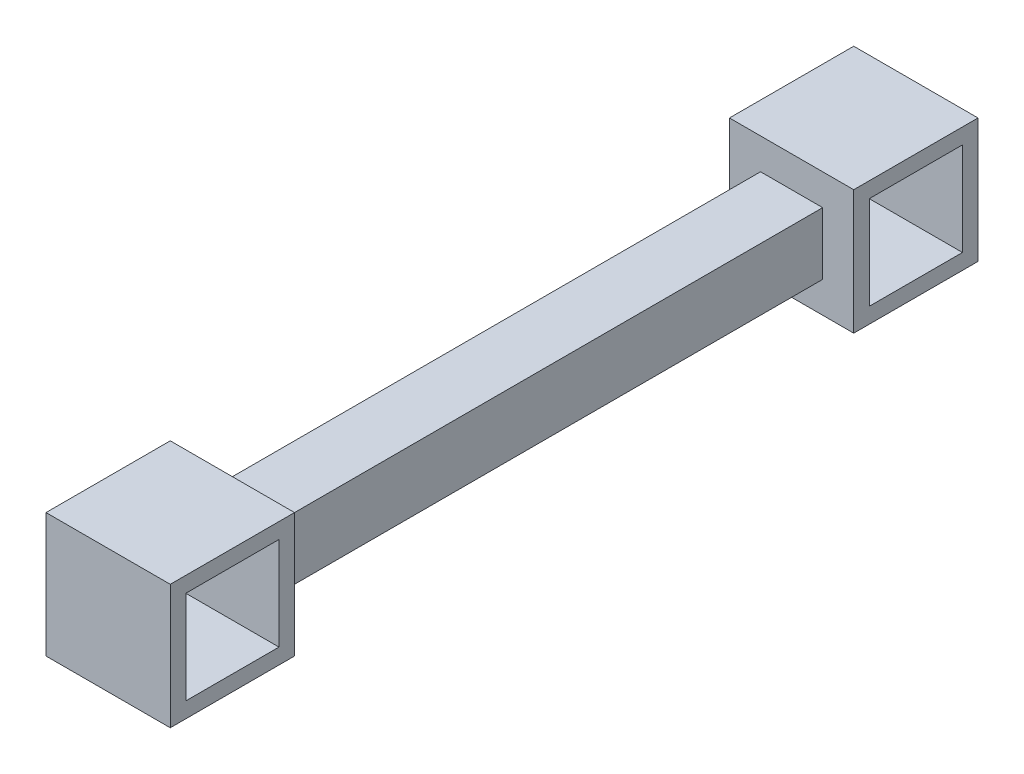
ISO-10303-21;
HEADER;
FILE_DESCRIPTION(('STEP AP214'),'2;1');
FILE_NAME('part.step','',(''),(''),'','','');
FILE_SCHEMA(('AUTOMOTIVE_DESIGN { 1 0 10303 214 1 1 1 1 }'));
ENDSEC;
DATA;
#1=APPLICATION_CONTEXT('core data for automotive mechanical design processes');
#2=APPLICATION_PROTOCOL_DEFINITION('international standard','automotive_design',2000,#1);
#3=PRODUCT_CONTEXT('',#1,'mechanical');
#4=PRODUCT('Part','Part','',(#3));
#5=PRODUCT_RELATED_PRODUCT_CATEGORY('part','',(#4));
#6=PRODUCT_DEFINITION_FORMATION('','',#4);
#7=PRODUCT_DEFINITION_CONTEXT('part definition',#1,'design');
#8=PRODUCT_DEFINITION('design','',#6,#7);
#9=PRODUCT_DEFINITION_SHAPE('','',#8);
#10=(LENGTH_UNIT() NAMED_UNIT(*) SI_UNIT(.MILLI.,.METRE.));
#11=(NAMED_UNIT(*) PLANE_ANGLE_UNIT() SI_UNIT($,.RADIAN.));
#12=(NAMED_UNIT(*) SI_UNIT($,.STERADIAN.) SOLID_ANGLE_UNIT());
#13=UNCERTAINTY_MEASURE_WITH_UNIT(LENGTH_MEASURE(1.E-05),#10,'distance_accuracy_value','');
#14=(GEOMETRIC_REPRESENTATION_CONTEXT(3) GLOBAL_UNCERTAINTY_ASSIGNED_CONTEXT((#13)) GLOBAL_UNIT_ASSIGNED_CONTEXT((#10,
#11,#12)) REPRESENTATION_CONTEXT('',''));
#15=CARTESIAN_POINT('',(0.,0.,0.));
#16=DIRECTION('',(0.,0.,1.));
#17=DIRECTION('',(1.,0.,0.));
#18=AXIS2_PLACEMENT_3D('',#15,#16,#17);
#19=CARTESIAN_POINT('',(-20.,20.,260.));
#20=DIRECTION('',(1.,0.,0.));
#21=DIRECTION('',(0.,1.,0.));
#22=AXIS2_PLACEMENT_3D('',#19,#20,#21);
#23=PLANE('',#22);
#24=DIRECTION('',(0.,0.,1.));
#25=VECTOR('',#24,1.);
#26=CARTESIAN_POINT('',(-20.,-15.,35.));
#27=LINE('',#26,#25);
#28=CARTESIAN_POINT('',(-20.,-15.,5.));
#29=VERTEX_POINT('',#28);
#30=CARTESIAN_POINT('',(-20.,-15.,35.));
#31=VERTEX_POINT('',#30);
#32=EDGE_CURVE('E219',#29,#31,#27,.T.);
#33=ORIENTED_EDGE('',*,*,#32,.F.);
#34=DIRECTION('',(0.,-1.,0.));
#35=VECTOR('',#34,1.);
#36=CARTESIAN_POINT('',(-20.,-15.,5.00000000000001));
#37=LINE('',#36,#35);
#38=CARTESIAN_POINT('',(-20.,15.,5.00000000000001));
#39=VERTEX_POINT('',#38);
#40=EDGE_CURVE('E63',#39,#29,#37,.T.);
#41=ORIENTED_EDGE('',*,*,#40,.F.);
#42=DIRECTION('',(0.,0.,-1.));
#43=VECTOR('',#42,1.);
#44=CARTESIAN_POINT('',(-20.,15.,35.));
#45=LINE('',#44,#43);
#46=CARTESIAN_POINT('',(-20.,15.,35.));
#47=VERTEX_POINT('',#46);
#48=EDGE_CURVE('E206',#47,#39,#45,.T.);
#49=ORIENTED_EDGE('',*,*,#48,.F.);
#50=DIRECTION('',(0.,1.,0.));
#51=VECTOR('',#50,1.);
#52=CARTESIAN_POINT('',(-20.,-15.,35.));
#53=LINE('',#52,#51);
#54=EDGE_CURVE('E210',#31,#47,#53,.T.);
#55=ORIENTED_EDGE('',*,*,#54,.F.);
#56=EDGE_LOOP('',(#33,#41,#49,#55));
#57=FACE_BOUND('',#56,.T.);
#58=DIRECTION('',(0.,-1.,0.));
#59=VECTOR('',#58,1.);
#60=CARTESIAN_POINT('',(-20.,20.,40.));
#61=LINE('',#60,#59);
#62=CARTESIAN_POINT('',(-20.,20.,40.));
#63=VERTEX_POINT('',#62);
#64=CARTESIAN_POINT('',(-20.,-20.,40.));
#65=VERTEX_POINT('',#64);
#66=EDGE_CURVE('E322',#63,#65,#61,.T.);
#67=ORIENTED_EDGE('',*,*,#66,.F.);
#68=DIRECTION('',(0.,0.,-1.));
#69=VECTOR('',#68,1.);
#70=CARTESIAN_POINT('',(-20.,20.,260.));
#71=LINE('',#70,#69);
#72=CARTESIAN_POINT('',(-20.,20.,0.));
#73=VERTEX_POINT('',#72);
#74=EDGE_CURVE('E364',#63,#73,#71,.T.);
#75=ORIENTED_EDGE('',*,*,#74,.T.);
#76=DIRECTION('',(0.,-1.,0.));
#77=VECTOR('',#76,1.);
#78=CARTESIAN_POINT('',(-20.,20.,0.));
#79=LINE('',#78,#77);
#80=CARTESIAN_POINT('',(-20.,-20.,0.));
#81=VERTEX_POINT('',#80);
#82=EDGE_CURVE('E335',#73,#81,#79,.T.);
#83=ORIENTED_EDGE('',*,*,#82,.T.);
#84=DIRECTION('',(0.,0.,-1.));
#85=VECTOR('',#84,1.);
#86=CARTESIAN_POINT('',(-20.,-20.,260.));
#87=LINE('',#86,#85);
#88=EDGE_CURVE('E56',#65,#81,#87,.T.);
#89=ORIENTED_EDGE('',*,*,#88,.F.);
#90=EDGE_LOOP('',(#67,#75,#83,#89));
#91=FACE_BOUND('',#90,.T.);
#92=ADVANCED_FACE('F47',(#57,#91),#23,.F.);
#93=CARTESIAN_POINT('',(20.,-20.,260.));
#94=DIRECTION('',(0.,1.,0.));
#95=DIRECTION('',(-1.,0.,0.));
#96=AXIS2_PLACEMENT_3D('',#93,#94,#95);
#97=PLANE('',#96);
#98=DIRECTION('',(1.,0.,0.));
#99=VECTOR('',#98,1.);
#100=CARTESIAN_POINT('',(-20.,-20.,40.));
#101=LINE('',#100,#99);
#102=CARTESIAN_POINT('',(20.,-20.,40.));
#103=VERTEX_POINT('',#102);
#104=EDGE_CURVE('E325',#65,#103,#101,.T.);
#105=ORIENTED_EDGE('',*,*,#104,.F.);
#106=ORIENTED_EDGE('',*,*,#88,.T.);
#107=DIRECTION('',(1.,0.,0.));
#108=VECTOR('',#107,1.);
#109=CARTESIAN_POINT('',(20.,-20.,0.));
#110=LINE('',#109,#108);
#111=CARTESIAN_POINT('',(20.,-20.,0.));
#112=VERTEX_POINT('',#111);
#113=EDGE_CURVE('E368',#81,#112,#110,.T.);
#114=ORIENTED_EDGE('',*,*,#113,.T.);
#115=DIRECTION('',(0.,0.,-1.));
#116=VECTOR('',#115,1.);
#117=CARTESIAN_POINT('',(20.,-20.,260.));
#118=LINE('',#117,#116);
#119=EDGE_CURVE('E387',#103,#112,#118,.T.);
#120=ORIENTED_EDGE('',*,*,#119,.F.);
#121=EDGE_LOOP('',(#105,#106,#114,#120));
#122=FACE_BOUND('',#121,.T.);
#123=ADVANCED_FACE('F404',(#122),#97,.F.);
#124=CARTESIAN_POINT('',(20.,20.,260.));
#125=DIRECTION('',(-1.,0.,0.));
#126=DIRECTION('',(0.,-1.,0.));
#127=AXIS2_PLACEMENT_3D('',#124,#125,#126);
#128=PLANE('',#127);
#129=DIRECTION('',(0.,0.,-1.));
#130=VECTOR('',#129,1.);
#131=CARTESIAN_POINT('',(20.,15.,35.));
#132=LINE('',#131,#130);
#133=CARTESIAN_POINT('',(20.,15.,35.));
#134=VERTEX_POINT('',#133);
#135=CARTESIAN_POINT('',(20.,15.,5.00000000000001));
#136=VERTEX_POINT('',#135);
#137=EDGE_CURVE('E194',#134,#136,#132,.T.);
#138=ORIENTED_EDGE('',*,*,#137,.T.);
#139=DIRECTION('',(0.,-1.,0.));
#140=VECTOR('',#139,1.);
#141=CARTESIAN_POINT('',(20.,-15.,5.00000000000001));
#142=LINE('',#141,#140);
#143=CARTESIAN_POINT('',(20.,-15.,5.00000000000001));
#144=VERTEX_POINT('',#143);
#145=EDGE_CURVE('E187',#136,#144,#142,.T.);
#146=ORIENTED_EDGE('',*,*,#145,.T.);
#147=DIRECTION('',(0.,0.,1.));
#148=VECTOR('',#147,1.);
#149=CARTESIAN_POINT('',(20.,-15.,35.));
#150=LINE('',#149,#148);
#151=CARTESIAN_POINT('',(20.,-15.,35.));
#152=VERTEX_POINT('',#151);
#153=EDGE_CURVE('E197',#144,#152,#150,.T.);
#154=ORIENTED_EDGE('',*,*,#153,.T.);
#155=DIRECTION('',(0.,1.,0.));
#156=VECTOR('',#155,1.);
#157=CARTESIAN_POINT('',(20.,-15.,35.));
#158=LINE('',#157,#156);
#159=EDGE_CURVE('E71',#152,#134,#158,.T.);
#160=ORIENTED_EDGE('',*,*,#159,.T.);
#161=EDGE_LOOP('',(#138,#146,#154,#160));
#162=FACE_BOUND('',#161,.T.);
#163=DIRECTION('',(0.,1.,0.));
#164=VECTOR('',#163,1.);
#165=CARTESIAN_POINT('',(20.,-20.,40.));
#166=LINE('',#165,#164);
#167=CARTESIAN_POINT('',(20.,20.,40.));
#168=VERTEX_POINT('',#167);
#169=EDGE_CURVE('E329',#103,#168,#166,.T.);
#170=ORIENTED_EDGE('',*,*,#169,.F.);
#171=ORIENTED_EDGE('',*,*,#119,.T.);
#172=DIRECTION('',(0.,1.,0.));
#173=VECTOR('',#172,1.);
#174=CARTESIAN_POINT('',(20.,20.,0.));
#175=LINE('',#174,#173);
#176=CARTESIAN_POINT('',(20.,20.,0.));
#177=VERTEX_POINT('',#176);
#178=EDGE_CURVE('E372',#112,#177,#175,.T.);
#179=ORIENTED_EDGE('',*,*,#178,.T.);
#180=DIRECTION('',(0.,0.,-1.));
#181=VECTOR('',#180,1.);
#182=CARTESIAN_POINT('',(20.,20.,260.));
#183=LINE('',#182,#181);
#184=EDGE_CURVE('E383',#168,#177,#183,.T.);
#185=ORIENTED_EDGE('',*,*,#184,.F.);
#186=EDGE_LOOP('',(#170,#171,#179,#185));
#187=FACE_BOUND('',#186,.T.);
#188=ADVANCED_FACE('F202',(#162,#187),#128,.F.);
#189=CARTESIAN_POINT('',(20.,20.,260.));
#190=DIRECTION('',(0.,-1.,0.));
#191=DIRECTION('',(1.,0.,0.));
#192=AXIS2_PLACEMENT_3D('',#189,#190,#191);
#193=PLANE('',#192);
#194=DIRECTION('',(-1.,0.,0.));
#195=VECTOR('',#194,1.);
#196=CARTESIAN_POINT('',(20.,20.,40.));
#197=LINE('',#196,#195);
#198=EDGE_CURVE('E332',#168,#63,#197,.T.);
#199=ORIENTED_EDGE('',*,*,#198,.F.);
#200=ORIENTED_EDGE('',*,*,#184,.T.);
#201=DIRECTION('',(-1.,0.,0.));
#202=VECTOR('',#201,1.);
#203=CARTESIAN_POINT('',(20.,20.,0.));
#204=LINE('',#203,#202);
#205=EDGE_CURVE('E355',#177,#73,#204,.T.);
#206=ORIENTED_EDGE('',*,*,#205,.T.);
#207=ORIENTED_EDGE('',*,*,#74,.F.);
#208=EDGE_LOOP('',(#199,#200,#206,#207));
#209=FACE_BOUND('',#208,.T.);
#210=ADVANCED_FACE('F412',(#209),#193,.F.);
#211=CARTESIAN_POINT('',(0.,0.,0.));
#212=DIRECTION('',(0.,0.,-1.));
#213=DIRECTION('',(-1.,0.,0.));
#214=AXIS2_PLACEMENT_3D('',#211,#212,#213);
#215=PLANE('',#214);
#216=ORIENTED_EDGE('',*,*,#82,.F.);
#217=ORIENTED_EDGE('',*,*,#205,.F.);
#218=ORIENTED_EDGE('',*,*,#178,.F.);
#219=ORIENTED_EDGE('',*,*,#113,.F.);
#220=EDGE_LOOP('',(#216,#217,#218,#219));
#221=FACE_BOUND('',#220,.T.);
#222=ADVANCED_FACE('F408',(#221),#215,.T.);
#223=CARTESIAN_POINT('',(0.,0.,40.));
#224=DIRECTION('',(0.,0.,1.));
#225=DIRECTION('',(1.,0.,0.));
#226=AXIS2_PLACEMENT_3D('',#223,#224,#225);
#227=PLANE('',#226);
#228=DIRECTION('',(0.,1.,0.));
#229=VECTOR('',#228,1.);
#230=CARTESIAN_POINT('',(10.,-10.,40.));
#231=LINE('',#230,#229);
#232=CARTESIAN_POINT('',(10.,-10.,40.));
#233=VERTEX_POINT('',#232);
#234=CARTESIAN_POINT('',(10.,10.,40.));
#235=VERTEX_POINT('',#234);
#236=EDGE_CURVE('E291',#233,#235,#231,.T.);
#237=ORIENTED_EDGE('',*,*,#236,.F.);
#238=DIRECTION('',(1.,0.,0.));
#239=VECTOR('',#238,1.);
#240=CARTESIAN_POINT('',(-10.,-10.,40.));
#241=LINE('',#240,#239);
#242=CARTESIAN_POINT('',(-10.,-10.,40.));
#243=VERTEX_POINT('',#242);
#244=EDGE_CURVE('E287',#243,#233,#241,.T.);
#245=ORIENTED_EDGE('',*,*,#244,.F.);
#246=DIRECTION('',(0.,-1.,0.));
#247=VECTOR('',#246,1.);
#248=CARTESIAN_POINT('',(-10.,10.,40.));
#249=LINE('',#248,#247);
#250=CARTESIAN_POINT('',(-10.,10.,40.));
#251=VERTEX_POINT('',#250);
#252=EDGE_CURVE('E282',#251,#243,#249,.T.);
#253=ORIENTED_EDGE('',*,*,#252,.F.);
#254=DIRECTION('',(-1.,0.,0.));
#255=VECTOR('',#254,1.);
#256=CARTESIAN_POINT('',(10.,10.,40.));
#257=LINE('',#256,#255);
#258=EDGE_CURVE('E278',#235,#251,#257,.T.);
#259=ORIENTED_EDGE('',*,*,#258,.F.);
#260=EDGE_LOOP('',(#237,#245,#253,#259));
#261=FACE_BOUND('',#260,.T.);
#262=ORIENTED_EDGE('',*,*,#66,.T.);
#263=ORIENTED_EDGE('',*,*,#104,.T.);
#264=ORIENTED_EDGE('',*,*,#169,.T.);
#265=ORIENTED_EDGE('',*,*,#198,.T.);
#266=EDGE_LOOP('',(#262,#263,#264,#265));
#267=FACE_BOUND('',#266,.T.);
#268=ADVANCED_FACE('F418',(#261,#267),#227,.T.);
#269=CARTESIAN_POINT('',(0.,0.,220.));
#270=DIRECTION('',(0.,0.,1.));
#271=DIRECTION('',(1.,0.,0.));
#272=AXIS2_PLACEMENT_3D('',#269,#270,#271);
#273=PLANE('',#272);
#274=DIRECTION('',(-1.,0.,0.));
#275=VECTOR('',#274,1.);
#276=CARTESIAN_POINT('',(10.,10.,220.));
#277=LINE('',#276,#275);
#278=CARTESIAN_POINT('',(10.,10.,220.));
#279=VERTEX_POINT('',#278);
#280=CARTESIAN_POINT('',(-10.,10.,220.));
#281=VERTEX_POINT('',#280);
#282=EDGE_CURVE('E229',#279,#281,#277,.T.);
#283=ORIENTED_EDGE('',*,*,#282,.T.);
#284=DIRECTION('',(0.,-1.,0.));
#285=VECTOR('',#284,1.);
#286=CARTESIAN_POINT('',(-10.,10.,220.));
#287=LINE('',#286,#285);
#288=CARTESIAN_POINT('',(-10.,-10.,220.));
#289=VERTEX_POINT('',#288);
#290=EDGE_CURVE('E298',#281,#289,#287,.T.);
#291=ORIENTED_EDGE('',*,*,#290,.T.);
#292=DIRECTION('',(1.,0.,0.));
#293=VECTOR('',#292,1.);
#294=CARTESIAN_POINT('',(-10.,-10.,220.));
#295=LINE('',#294,#293);
#296=CARTESIAN_POINT('',(10.,-10.,220.));
#297=VERTEX_POINT('',#296);
#298=EDGE_CURVE('E302',#289,#297,#295,.T.);
#299=ORIENTED_EDGE('',*,*,#298,.T.);
#300=DIRECTION('',(0.,1.,0.));
#301=VECTOR('',#300,1.);
#302=CARTESIAN_POINT('',(10.,-10.,220.));
#303=LINE('',#302,#301);
#304=EDGE_CURVE('E283',#297,#279,#303,.T.);
#305=ORIENTED_EDGE('',*,*,#304,.T.);
#306=EDGE_LOOP('',(#283,#291,#299,#305));
#307=FACE_BOUND('',#306,.T.);
#308=DIRECTION('',(0.,-1.,0.));
#309=VECTOR('',#308,1.);
#310=CARTESIAN_POINT('',(-20.,20.,220.));
#311=LINE('',#310,#309);
#312=CARTESIAN_POINT('',(-20.,20.,220.));
#313=VERTEX_POINT('',#312);
#314=CARTESIAN_POINT('',(-20.,-20.,220.));
#315=VERTEX_POINT('',#314);
#316=EDGE_CURVE('E312',#313,#315,#311,.T.);
#317=ORIENTED_EDGE('',*,*,#316,.F.);
#318=DIRECTION('',(-1.,0.,0.));
#319=VECTOR('',#318,1.);
#320=CARTESIAN_POINT('',(20.,20.,220.));
#321=LINE('',#320,#319);
#322=CARTESIAN_POINT('',(20.,20.,220.));
#323=VERTEX_POINT('',#322);
#324=EDGE_CURVE('E326',#323,#313,#321,.T.);
#325=ORIENTED_EDGE('',*,*,#324,.F.);
#326=DIRECTION('',(0.,1.,0.));
#327=VECTOR('',#326,1.);
#328=CARTESIAN_POINT('',(20.,-20.,220.));
#329=LINE('',#328,#327);
#330=CARTESIAN_POINT('',(20.,-20.,220.));
#331=VERTEX_POINT('',#330);
#332=EDGE_CURVE('E343',#331,#323,#329,.T.);
#333=ORIENTED_EDGE('',*,*,#332,.F.);
#334=DIRECTION('',(1.,0.,0.));
#335=VECTOR('',#334,1.);
#336=CARTESIAN_POINT('',(-20.,-20.,220.));
#337=LINE('',#336,#335);
#338=EDGE_CURVE('E339',#315,#331,#337,.T.);
#339=ORIENTED_EDGE('',*,*,#338,.F.);
#340=EDGE_LOOP('',(#317,#325,#333,#339));
#341=FACE_BOUND('',#340,.T.);
#342=ADVANCED_FACE('F420',(#307,#341),#273,.F.);
#343=CARTESIAN_POINT('',(10.,10.,40.));
#344=DIRECTION('',(0.,1.,0.));
#345=DIRECTION('',(-1.,0.,0.));
#346=AXIS2_PLACEMENT_3D('',#343,#344,#345);
#347=PLANE('',#346);
#348=ORIENTED_EDGE('',*,*,#282,.F.);
#349=DIRECTION('',(0.,0.,1.));
#350=VECTOR('',#349,1.);
#351=CARTESIAN_POINT('',(10.,10.,40.));
#352=LINE('',#351,#350);
#353=EDGE_CURVE('E309',#235,#279,#352,.T.);
#354=ORIENTED_EDGE('',*,*,#353,.F.);
#355=ORIENTED_EDGE('',*,*,#258,.T.);
#356=DIRECTION('',(0.,0.,1.));
#357=VECTOR('',#356,1.);
#358=CARTESIAN_POINT('',(-10.,10.,40.));
#359=LINE('',#358,#357);
#360=EDGE_CURVE('E295',#251,#281,#359,.T.);
#361=ORIENTED_EDGE('',*,*,#360,.T.);
#362=EDGE_LOOP('',(#348,#354,#355,#361));
#363=FACE_BOUND('',#362,.T.);
#364=ADVANCED_FACE('F427',(#363),#347,.T.);
#365=CARTESIAN_POINT('',(10.,-10.,40.));
#366=DIRECTION('',(1.,0.,0.));
#367=DIRECTION('',(0.,0.,-1.));
#368=AXIS2_PLACEMENT_3D('',#365,#366,#367);
#369=PLANE('',#368);
#370=ORIENTED_EDGE('',*,*,#304,.F.);
#371=DIRECTION('',(0.,0.,1.));
#372=VECTOR('',#371,1.);
#373=CARTESIAN_POINT('',(10.,-10.,40.));
#374=LINE('',#373,#372);
#375=EDGE_CURVE('E313',#233,#297,#374,.T.);
#376=ORIENTED_EDGE('',*,*,#375,.F.);
#377=ORIENTED_EDGE('',*,*,#236,.T.);
#378=ORIENTED_EDGE('',*,*,#353,.T.);
#379=EDGE_LOOP('',(#370,#376,#377,#378));
#380=FACE_BOUND('',#379,.T.);
#381=ADVANCED_FACE('F535',(#380),#369,.T.);
#382=CARTESIAN_POINT('',(-10.,-10.,40.));
#383=DIRECTION('',(0.,-1.,0.));
#384=DIRECTION('',(1.,0.,0.));
#385=AXIS2_PLACEMENT_3D('',#382,#383,#384);
#386=PLANE('',#385);
#387=ORIENTED_EDGE('',*,*,#298,.F.);
#388=DIRECTION('',(0.,0.,1.));
#389=VECTOR('',#388,1.);
#390=CARTESIAN_POINT('',(-10.,-10.,40.));
#391=LINE('',#390,#389);
#392=EDGE_CURVE('E316',#243,#289,#391,.T.);
#393=ORIENTED_EDGE('',*,*,#392,.F.);
#394=ORIENTED_EDGE('',*,*,#244,.T.);
#395=ORIENTED_EDGE('',*,*,#375,.T.);
#396=EDGE_LOOP('',(#387,#393,#394,#395));
#397=FACE_BOUND('',#396,.T.);
#398=ADVANCED_FACE('F476',(#397),#386,.T.);
#399=CARTESIAN_POINT('',(-10.,10.,40.));
#400=DIRECTION('',(-1.,0.,0.));
#401=DIRECTION('',(0.,-1.,0.));
#402=AXIS2_PLACEMENT_3D('',#399,#400,#401);
#403=PLANE('',#402);
#404=ORIENTED_EDGE('',*,*,#290,.F.);
#405=ORIENTED_EDGE('',*,*,#360,.F.);
#406=ORIENTED_EDGE('',*,*,#252,.T.);
#407=ORIENTED_EDGE('',*,*,#392,.T.);
#408=EDGE_LOOP('',(#404,#405,#406,#407));
#409=FACE_BOUND('',#408,.T.);
#410=ADVANCED_FACE('F469',(#409),#403,.T.);
#411=CARTESIAN_POINT('',(0.,0.,260.));
#412=DIRECTION('',(0.,0.,-1.));
#413=DIRECTION('',(-1.,0.,0.));
#414=AXIS2_PLACEMENT_3D('',#411,#412,#413);
#415=PLANE('',#414);
#416=DIRECTION('',(0.,-1.,0.));
#417=VECTOR('',#416,1.);
#418=CARTESIAN_POINT('',(-20.,20.,260.));
#419=LINE('',#418,#417);
#420=CARTESIAN_POINT('',(-20.,20.,260.));
#421=VERTEX_POINT('',#420);
#422=CARTESIAN_POINT('',(-20.,-20.,260.));
#423=VERTEX_POINT('',#422);
#424=EDGE_CURVE('E350',#421,#423,#419,.T.);
#425=ORIENTED_EDGE('',*,*,#424,.T.);
#426=DIRECTION('',(1.,0.,0.));
#427=VECTOR('',#426,1.);
#428=CARTESIAN_POINT('',(20.,-20.,260.));
#429=LINE('',#428,#427);
#430=CARTESIAN_POINT('',(20.,-20.,260.));
#431=VERTEX_POINT('',#430);
#432=EDGE_CURVE('E354',#423,#431,#429,.T.);
#433=ORIENTED_EDGE('',*,*,#432,.T.);
#434=DIRECTION('',(0.,1.,0.));
#435=VECTOR('',#434,1.);
#436=CARTESIAN_POINT('',(20.,20.,260.));
#437=LINE('',#436,#435);
#438=CARTESIAN_POINT('',(20.,20.,260.));
#439=VERTEX_POINT('',#438);
#440=EDGE_CURVE('E358',#431,#439,#437,.T.);
#441=ORIENTED_EDGE('',*,*,#440,.T.);
#442=DIRECTION('',(-1.,0.,0.));
#443=VECTOR('',#442,1.);
#444=CARTESIAN_POINT('',(20.,20.,260.));
#445=LINE('',#444,#443);
#446=EDGE_CURVE('E361',#439,#421,#445,.T.);
#447=ORIENTED_EDGE('',*,*,#446,.T.);
#448=EDGE_LOOP('',(#425,#433,#441,#447));
#449=FACE_BOUND('',#448,.T.);
#450=ADVANCED_FACE('F467',(#449),#415,.F.);
#451=EDGE_CURVE('E384',#439,#323,#183,.T.);
#452=ORIENTED_EDGE('',*,*,#451,.T.);
#453=ORIENTED_EDGE('',*,*,#324,.T.);
#454=EDGE_CURVE('E379',#421,#313,#71,.T.);
#455=ORIENTED_EDGE('',*,*,#454,.F.);
#456=ORIENTED_EDGE('',*,*,#446,.F.);
#457=EDGE_LOOP('',(#452,#453,#455,#456));
#458=FACE_BOUND('',#457,.T.);
#459=ADVANCED_FACE('F463',(#458),#193,.F.);
#460=DIRECTION('',(0.,-1.,0.));
#461=VECTOR('',#460,1.);
#462=CARTESIAN_POINT('',(20.,-15.,225.));
#463=LINE('',#462,#461);
#464=CARTESIAN_POINT('',(20.,15.,225.));
#465=VERTEX_POINT('',#464);
#466=CARTESIAN_POINT('',(20.,-15.,225.));
#467=VERTEX_POINT('',#466);
#468=EDGE_CURVE('E239',#465,#467,#463,.T.);
#469=ORIENTED_EDGE('',*,*,#468,.T.);
#470=DIRECTION('',(0.,0.,1.));
#471=VECTOR('',#470,1.);
#472=CARTESIAN_POINT('',(20.,-15.,225.));
#473=LINE('',#472,#471);
#474=CARTESIAN_POINT('',(20.,-15.,255.));
#475=VERTEX_POINT('',#474);
#476=EDGE_CURVE('E254',#467,#475,#473,.T.);
#477=ORIENTED_EDGE('',*,*,#476,.T.);
#478=DIRECTION('',(0.,1.,0.));
#479=VECTOR('',#478,1.);
#480=CARTESIAN_POINT('',(20.,-15.,255.));
#481=LINE('',#480,#479);
#482=CARTESIAN_POINT('',(20.,15.,255.));
#483=VERTEX_POINT('',#482);
#484=EDGE_CURVE('E271',#475,#483,#481,.T.);
#485=ORIENTED_EDGE('',*,*,#484,.T.);
#486=DIRECTION('',(0.,0.,-1.));
#487=VECTOR('',#486,1.);
#488=CARTESIAN_POINT('',(20.,15.,225.));
#489=LINE('',#488,#487);
#490=EDGE_CURVE('E267',#483,#465,#489,.T.);
#491=ORIENTED_EDGE('',*,*,#490,.T.);
#492=EDGE_LOOP('',(#469,#477,#485,#491));
#493=FACE_BOUND('',#492,.T.);
#494=EDGE_CURVE('E388',#431,#331,#118,.T.);
#495=ORIENTED_EDGE('',*,*,#494,.T.);
#496=ORIENTED_EDGE('',*,*,#332,.T.);
#497=ORIENTED_EDGE('',*,*,#451,.F.);
#498=ORIENTED_EDGE('',*,*,#440,.F.);
#499=EDGE_LOOP('',(#495,#496,#497,#498));
#500=FACE_BOUND('',#499,.T.);
#501=ADVANCED_FACE('F452',(#493,#500),#128,.F.);
#502=EDGE_CURVE('E11',#423,#315,#87,.T.);
#503=ORIENTED_EDGE('',*,*,#502,.T.);
#504=ORIENTED_EDGE('',*,*,#338,.T.);
#505=ORIENTED_EDGE('',*,*,#494,.F.);
#506=ORIENTED_EDGE('',*,*,#432,.F.);
#507=EDGE_LOOP('',(#503,#504,#505,#506));
#508=FACE_BOUND('',#507,.T.);
#509=ADVANCED_FACE('F441',(#508),#97,.F.);
#510=DIRECTION('',(0.,1.,0.));
#511=VECTOR('',#510,1.);
#512=CARTESIAN_POINT('',(-20.,-15.,255.));
#513=LINE('',#512,#511);
#514=CARTESIAN_POINT('',(-20.,-15.,255.));
#515=VERTEX_POINT('',#514);
#516=CARTESIAN_POINT('',(-20.,15.,255.));
#517=VERTEX_POINT('',#516);
#518=EDGE_CURVE('E258',#515,#517,#513,.T.);
#519=ORIENTED_EDGE('',*,*,#518,.F.);
#520=DIRECTION('',(0.,0.,1.));
#521=VECTOR('',#520,1.);
#522=CARTESIAN_POINT('',(-20.,-15.,225.));
#523=LINE('',#522,#521);
#524=CARTESIAN_POINT('',(-20.,-15.,225.));
#525=VERTEX_POINT('',#524);
#526=EDGE_CURVE('E220',#525,#515,#523,.T.);
#527=ORIENTED_EDGE('',*,*,#526,.F.);
#528=DIRECTION('',(0.,-1.,0.));
#529=VECTOR('',#528,1.);
#530=CARTESIAN_POINT('',(-20.,-15.,225.));
#531=LINE('',#530,#529);
#532=CARTESIAN_POINT('',(-20.,15.,225.));
#533=VERTEX_POINT('',#532);
#534=EDGE_CURVE('E249',#533,#525,#531,.T.);
#535=ORIENTED_EDGE('',*,*,#534,.F.);
#536=DIRECTION('',(0.,0.,-1.));
#537=VECTOR('',#536,1.);
#538=CARTESIAN_POINT('',(-20.,15.,225.));
#539=LINE('',#538,#537);
#540=EDGE_CURVE('E253',#517,#533,#539,.T.);
#541=ORIENTED_EDGE('',*,*,#540,.F.);
#542=EDGE_LOOP('',(#519,#527,#535,#541));
#543=FACE_BOUND('',#542,.T.);
#544=ORIENTED_EDGE('',*,*,#454,.T.);
#545=ORIENTED_EDGE('',*,*,#316,.T.);
#546=ORIENTED_EDGE('',*,*,#502,.F.);
#547=ORIENTED_EDGE('',*,*,#424,.F.);
#548=EDGE_LOOP('',(#544,#545,#546,#547));
#549=FACE_BOUND('',#548,.T.);
#550=ADVANCED_FACE('F49',(#543,#549),#23,.F.);
#551=CARTESIAN_POINT('',(20.,-15.,225.));
#552=DIRECTION('',(0.,-1.,0.));
#553=DIRECTION('',(1.,0.,0.));
#554=AXIS2_PLACEMENT_3D('',#551,#552,#553);
#555=PLANE('',#554);
#556=ORIENTED_EDGE('',*,*,#526,.T.);
#557=DIRECTION('',(-1.,0.,0.));
#558=VECTOR('',#557,1.);
#559=CARTESIAN_POINT('',(20.,-15.,255.));
#560=LINE('',#559,#558);
#561=EDGE_CURVE('E235',#475,#515,#560,.T.);
#562=ORIENTED_EDGE('',*,*,#561,.F.);
#563=ORIENTED_EDGE('',*,*,#476,.F.);
#564=DIRECTION('',(-1.,0.,0.));
#565=VECTOR('',#564,1.);
#566=CARTESIAN_POINT('',(20.,-15.,225.));
#567=LINE('',#566,#565);
#568=EDGE_CURVE('E246',#467,#525,#567,.T.);
#569=ORIENTED_EDGE('',*,*,#568,.T.);
#570=EDGE_LOOP('',(#556,#562,#563,#569));
#571=FACE_BOUND('',#570,.T.);
#572=ADVANCED_FACE('F443',(#571),#555,.F.);
#573=CARTESIAN_POINT('',(20.,-15.,225.));
#574=DIRECTION('',(0.,0.,-1.));
#575=DIRECTION('',(-1.,0.,0.));
#576=AXIS2_PLACEMENT_3D('',#573,#574,#575);
#577=PLANE('',#576);
#578=ORIENTED_EDGE('',*,*,#534,.T.);
#579=ORIENTED_EDGE('',*,*,#568,.F.);
#580=ORIENTED_EDGE('',*,*,#468,.F.);
#581=DIRECTION('',(-1.,0.,0.));
#582=VECTOR('',#581,1.);
#583=CARTESIAN_POINT('',(20.,15.,225.));
#584=LINE('',#583,#582);
#585=EDGE_CURVE('E243',#465,#533,#584,.T.);
#586=ORIENTED_EDGE('',*,*,#585,.T.);
#587=EDGE_LOOP('',(#578,#579,#580,#586));
#588=FACE_BOUND('',#587,.T.);
#589=ADVANCED_FACE('F449',(#588),#577,.F.);
#590=CARTESIAN_POINT('',(20.,15.,225.));
#591=DIRECTION('',(0.,1.,0.));
#592=DIRECTION('',(-1.,0.,0.));
#593=AXIS2_PLACEMENT_3D('',#590,#591,#592);
#594=PLANE('',#593);
#595=ORIENTED_EDGE('',*,*,#540,.T.);
#596=ORIENTED_EDGE('',*,*,#585,.F.);
#597=ORIENTED_EDGE('',*,*,#490,.F.);
#598=DIRECTION('',(-1.,0.,0.));
#599=VECTOR('',#598,1.);
#600=CARTESIAN_POINT('',(20.,15.,255.));
#601=LINE('',#600,#599);
#602=EDGE_CURVE('E240',#483,#517,#601,.T.);
#603=ORIENTED_EDGE('',*,*,#602,.T.);
#604=EDGE_LOOP('',(#595,#596,#597,#603));
#605=FACE_BOUND('',#604,.T.);
#606=ADVANCED_FACE('F588',(#605),#594,.F.);
#607=CARTESIAN_POINT('',(20.,-15.,255.));
#608=DIRECTION('',(0.,0.,1.));
#609=DIRECTION('',(1.,0.,0.));
#610=AXIS2_PLACEMENT_3D('',#607,#608,#609);
#611=PLANE('',#610);
#612=ORIENTED_EDGE('',*,*,#518,.T.);
#613=ORIENTED_EDGE('',*,*,#602,.F.);
#614=ORIENTED_EDGE('',*,*,#484,.F.);
#615=ORIENTED_EDGE('',*,*,#561,.T.);
#616=EDGE_LOOP('',(#612,#613,#614,#615));
#617=FACE_BOUND('',#616,.T.);
#618=ADVANCED_FACE('F597',(#617),#611,.F.);
#619=CARTESIAN_POINT('',(20.,-15.,5.00000000000001));
#620=DIRECTION('',(0.,0.,-1.));
#621=DIRECTION('',(-1.,0.,0.));
#622=AXIS2_PLACEMENT_3D('',#619,#620,#621);
#623=PLANE('',#622);
#624=ORIENTED_EDGE('',*,*,#40,.T.);
#625=DIRECTION('',(-1.,0.,0.));
#626=VECTOR('',#625,1.);
#627=CARTESIAN_POINT('',(20.,-15.,5.00000000000001));
#628=LINE('',#627,#626);
#629=EDGE_CURVE('E183',#144,#29,#628,.T.);
#630=ORIENTED_EDGE('',*,*,#629,.F.);
#631=ORIENTED_EDGE('',*,*,#145,.F.);
#632=DIRECTION('',(-1.,0.,0.));
#633=VECTOR('',#632,1.);
#634=CARTESIAN_POINT('',(20.,15.,5.00000000000001));
#635=LINE('',#634,#633);
#636=EDGE_CURVE('E226',#136,#39,#635,.T.);
#637=ORIENTED_EDGE('',*,*,#636,.T.);
#638=EDGE_LOOP('',(#624,#630,#631,#637));
#639=FACE_BOUND('',#638,.T.);
#640=ADVANCED_FACE('F185',(#639),#623,.F.);
#641=CARTESIAN_POINT('',(20.,15.,35.));
#642=DIRECTION('',(0.,1.,0.));
#643=DIRECTION('',(-1.,0.,0.));
#644=AXIS2_PLACEMENT_3D('',#641,#642,#643);
#645=PLANE('',#644);
#646=ORIENTED_EDGE('',*,*,#48,.T.);
#647=ORIENTED_EDGE('',*,*,#636,.F.);
#648=ORIENTED_EDGE('',*,*,#137,.F.);
#649=DIRECTION('',(-1.,0.,0.));
#650=VECTOR('',#649,1.);
#651=CARTESIAN_POINT('',(20.,15.,35.));
#652=LINE('',#651,#650);
#653=EDGE_CURVE('E230',#134,#47,#652,.T.);
#654=ORIENTED_EDGE('',*,*,#653,.T.);
#655=EDGE_LOOP('',(#646,#647,#648,#654));
#656=FACE_BOUND('',#655,.T.);
#657=ADVANCED_FACE('F614',(#656),#645,.F.);
#658=CARTESIAN_POINT('',(20.,-15.,35.));
#659=DIRECTION('',(0.,0.,1.));
#660=DIRECTION('',(1.,0.,0.));
#661=AXIS2_PLACEMENT_3D('',#658,#659,#660);
#662=PLANE('',#661);
#663=ORIENTED_EDGE('',*,*,#54,.T.);
#664=ORIENTED_EDGE('',*,*,#653,.F.);
#665=ORIENTED_EDGE('',*,*,#159,.F.);
#666=DIRECTION('',(-1.,0.,0.));
#667=VECTOR('',#666,1.);
#668=CARTESIAN_POINT('',(20.,-15.,35.));
#669=LINE('',#668,#667);
#670=EDGE_CURVE('E193',#152,#31,#669,.T.);
#671=ORIENTED_EDGE('',*,*,#670,.T.);
#672=EDGE_LOOP('',(#663,#664,#665,#671));
#673=FACE_BOUND('',#672,.T.);
#674=ADVANCED_FACE('F622',(#673),#662,.F.);
#675=CARTESIAN_POINT('',(20.,-15.,35.));
#676=DIRECTION('',(0.,-1.,0.));
#677=DIRECTION('',(1.,0.,0.));
#678=AXIS2_PLACEMENT_3D('',#675,#676,#677);
#679=PLANE('',#678);
#680=ORIENTED_EDGE('',*,*,#32,.T.);
#681=ORIENTED_EDGE('',*,*,#670,.F.);
#682=ORIENTED_EDGE('',*,*,#153,.F.);
#683=ORIENTED_EDGE('',*,*,#629,.T.);
#684=EDGE_LOOP('',(#680,#681,#682,#683));
#685=FACE_BOUND('',#684,.T.);
#686=ADVANCED_FACE('F198',(#685),#679,.F.);
#687=CLOSED_SHELL('',(#92,#123,#188,#210,#222,#268,#342,#364,#381,#398,#410,#450,#459,#501,#509,
#550,#572,#589,#606,#618,#640,#657,#674,#686));
#688=MANIFOLD_SOLID_BREP('B2',#687);
#689=ADVANCED_BREP_SHAPE_REPRESENTATION('',(#18,#688),#14);
#690=SHAPE_DEFINITION_REPRESENTATION(#9,#689);
ENDSEC;
END-ISO-10303-21;
